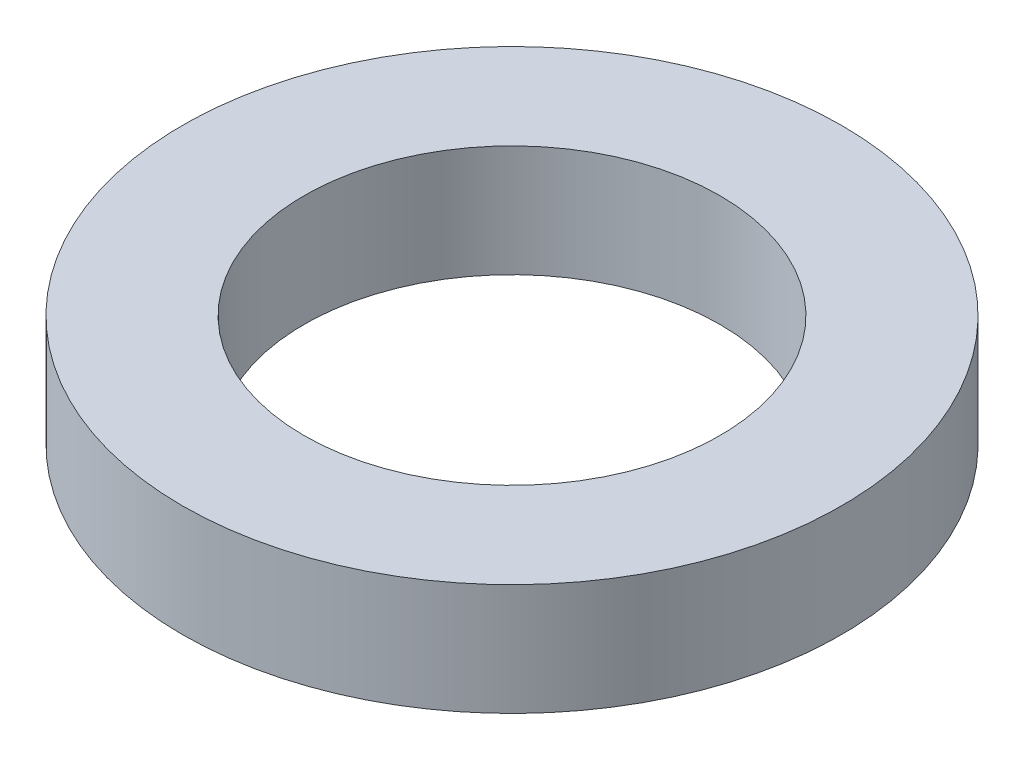
ISO-10303-21;
HEADER;
FILE_DESCRIPTION(('STEP AP214'),'2;1');
FILE_NAME('part.step','',(''),(''),'','','');
FILE_SCHEMA(('AUTOMOTIVE_DESIGN { 1 0 10303 214 1 1 1 1 }'));
ENDSEC;
DATA;
#1=APPLICATION_CONTEXT('core data for automotive mechanical design processes');
#2=APPLICATION_PROTOCOL_DEFINITION('international standard','automotive_design',2000,#1);
#3=PRODUCT_CONTEXT('',#1,'mechanical');
#4=PRODUCT('Part','Part','',(#3));
#5=PRODUCT_RELATED_PRODUCT_CATEGORY('part','',(#4));
#6=PRODUCT_DEFINITION_FORMATION('','',#4);
#7=PRODUCT_DEFINITION_CONTEXT('part definition',#1,'design');
#8=PRODUCT_DEFINITION('design','',#6,#7);
#9=PRODUCT_DEFINITION_SHAPE('','',#8);
#10=(LENGTH_UNIT() NAMED_UNIT(*) SI_UNIT(.MILLI.,.METRE.));
#11=(NAMED_UNIT(*) PLANE_ANGLE_UNIT() SI_UNIT($,.RADIAN.));
#12=(NAMED_UNIT(*) SI_UNIT($,.STERADIAN.) SOLID_ANGLE_UNIT());
#13=UNCERTAINTY_MEASURE_WITH_UNIT(LENGTH_MEASURE(1.E-05),#10,'distance_accuracy_value','');
#14=(GEOMETRIC_REPRESENTATION_CONTEXT(3) GLOBAL_UNCERTAINTY_ASSIGNED_CONTEXT((#13)) GLOBAL_UNIT_ASSIGNED_CONTEXT((#10,
#11,#12)) REPRESENTATION_CONTEXT('',''));
#15=CARTESIAN_POINT('',(0.,0.,0.));
#16=DIRECTION('',(0.,0.,1.));
#17=DIRECTION('',(1.,0.,0.));
#18=AXIS2_PLACEMENT_3D('',#15,#16,#17);
#19=CARTESIAN_POINT('',(0.,1.1,0.));
#20=DIRECTION('',(0.,1.,0.));
#21=DIRECTION('',(0.,0.,1.));
#22=AXIS2_PLACEMENT_3D('',#19,#20,#21);
#23=PLANE('',#22);
#24=CARTESIAN_POINT('',(0.,1.1,0.));
#25=DIRECTION('',(0.,1.,0.));
#26=DIRECTION('',(0.,0.,1.));
#27=AXIS2_PLACEMENT_3D('',#24,#25,#26);
#28=CIRCLE('',#27,3.25);
#29=CARTESIAN_POINT('',(0.,1.1,3.25));
#30=VERTEX_POINT('',#29);
#31=EDGE_CURVE('E10',#30,#30,#28,.T.);
#32=ORIENTED_EDGE('',*,*,#31,.T.);
#33=EDGE_LOOP('',(#32));
#34=FACE_BOUND('',#33,.T.);
#35=CARTESIAN_POINT('',(0.,1.1,0.));
#36=DIRECTION('',(0.,1.,0.));
#37=DIRECTION('',(0.,0.,1.));
#38=AXIS2_PLACEMENT_3D('',#35,#36,#37);
#39=CIRCLE('',#38,2.05);
#40=CARTESIAN_POINT('',(0.,1.1,2.05));
#41=VERTEX_POINT('',#40);
#42=EDGE_CURVE('E50',#41,#41,#39,.T.);
#43=ORIENTED_EDGE('',*,*,#42,.F.);
#44=EDGE_LOOP('',(#43));
#45=FACE_BOUND('',#44,.T.);
#46=ADVANCED_FACE('F39',(#34,#45),#23,.T.);
#47=CARTESIAN_POINT('',(0.,0.,0.));
#48=DIRECTION('',(0.,1.,0.));
#49=DIRECTION('',(0.,0.,1.));
#50=AXIS2_PLACEMENT_3D('',#47,#48,#49);
#51=PLANE('',#50);
#52=CARTESIAN_POINT('',(0.,0.,0.));
#53=DIRECTION('',(0.,1.,0.));
#54=DIRECTION('',(0.,0.,1.));
#55=AXIS2_PLACEMENT_3D('',#52,#53,#54);
#56=CIRCLE('',#55,3.25);
#57=CARTESIAN_POINT('',(0.,0.,3.25));
#58=VERTEX_POINT('',#57);
#59=EDGE_CURVE('E43',#58,#58,#56,.T.);
#60=ORIENTED_EDGE('',*,*,#59,.F.);
#61=EDGE_LOOP('',(#60));
#62=FACE_BOUND('',#61,.T.);
#63=CARTESIAN_POINT('',(0.,0.,0.));
#64=DIRECTION('',(0.,1.,0.));
#65=DIRECTION('',(0.,0.,1.));
#66=AXIS2_PLACEMENT_3D('',#63,#64,#65);
#67=CIRCLE('',#66,2.05);
#68=CARTESIAN_POINT('',(0.,0.,2.05));
#69=VERTEX_POINT('',#68);
#70=EDGE_CURVE('E52',#69,#69,#67,.T.);
#71=ORIENTED_EDGE('',*,*,#70,.T.);
#72=EDGE_LOOP('',(#71));
#73=FACE_BOUND('',#72,.T.);
#74=ADVANCED_FACE('F62',(#62,#73),#51,.F.);
#75=CARTESIAN_POINT('',(0.,1.1,0.));
#76=DIRECTION('',(0.,-1.,0.));
#77=DIRECTION('',(0.,0.,-1.));
#78=AXIS2_PLACEMENT_3D('',#75,#76,#77);
#79=CYLINDRICAL_SURFACE('',#78,3.25);
#80=ORIENTED_EDGE('',*,*,#31,.F.);
#81=EDGE_LOOP('',(#80));
#82=FACE_BOUND('',#81,.T.);
#83=ORIENTED_EDGE('',*,*,#59,.T.);
#84=EDGE_LOOP('',(#83));
#85=FACE_BOUND('',#84,.T.);
#86=ADVANCED_FACE('F41',(#82,#85),#79,.T.);
#87=CARTESIAN_POINT('',(0.,1.1,0.));
#88=DIRECTION('',(0.,-1.,0.));
#89=DIRECTION('',(0.,0.,-1.));
#90=AXIS2_PLACEMENT_3D('',#87,#88,#89);
#91=CYLINDRICAL_SURFACE('',#90,2.05);
#92=ORIENTED_EDGE('',*,*,#42,.T.);
#93=EDGE_LOOP('',(#92));
#94=FACE_BOUND('',#93,.T.);
#95=ORIENTED_EDGE('',*,*,#70,.F.);
#96=EDGE_LOOP('',(#95));
#97=FACE_BOUND('',#96,.T.);
#98=ADVANCED_FACE('F58',(#94,#97),#91,.F.);
#99=CLOSED_SHELL('',(#46,#74,#86,#98));
#100=MANIFOLD_SOLID_BREP('B2',#99);
#101=ADVANCED_BREP_SHAPE_REPRESENTATION('',(#18,#100),#14);
#102=SHAPE_DEFINITION_REPRESENTATION(#9,#101);
ENDSEC;
END-ISO-10303-21;
